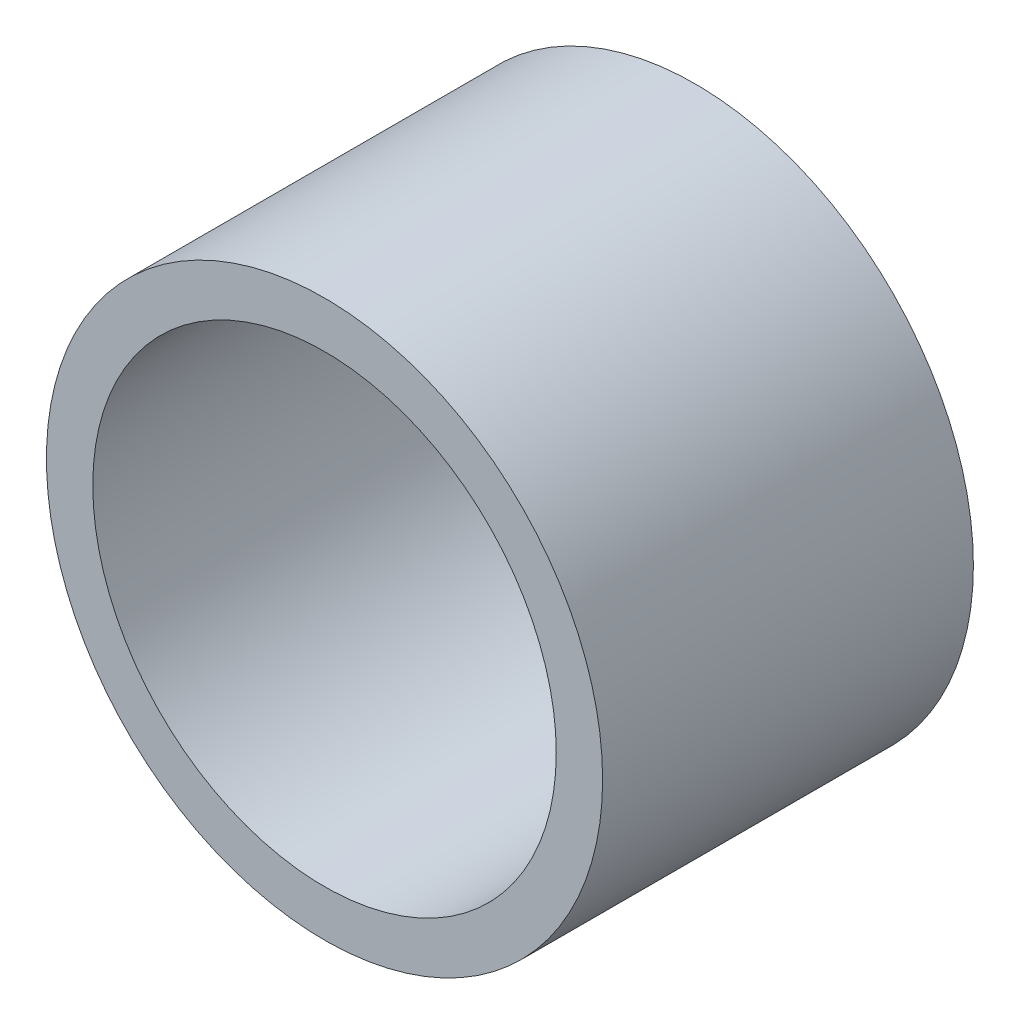
ISO-10303-21;
HEADER;
FILE_DESCRIPTION(('STEP AP214'),'2;1');
FILE_NAME('part.step','',(''),(''),'','','');
FILE_SCHEMA(('AUTOMOTIVE_DESIGN { 1 0 10303 214 1 1 1 1 }'));
ENDSEC;
DATA;
#1=APPLICATION_CONTEXT('core data for automotive mechanical design processes');
#2=APPLICATION_PROTOCOL_DEFINITION('international standard','automotive_design',2000,#1);
#3=PRODUCT_CONTEXT('',#1,'mechanical');
#4=PRODUCT('Part','Part','',(#3));
#5=PRODUCT_RELATED_PRODUCT_CATEGORY('part','',(#4));
#6=PRODUCT_DEFINITION_FORMATION('','',#4);
#7=PRODUCT_DEFINITION_CONTEXT('part definition',#1,'design');
#8=PRODUCT_DEFINITION('design','',#6,#7);
#9=PRODUCT_DEFINITION_SHAPE('','',#8);
#10=(LENGTH_UNIT() NAMED_UNIT(*) SI_UNIT(.MILLI.,.METRE.));
#11=(NAMED_UNIT(*) PLANE_ANGLE_UNIT() SI_UNIT($,.RADIAN.));
#12=(NAMED_UNIT(*) SI_UNIT($,.STERADIAN.) SOLID_ANGLE_UNIT());
#13=UNCERTAINTY_MEASURE_WITH_UNIT(LENGTH_MEASURE(1.E-05),#10,'distance_accuracy_value','');
#14=(GEOMETRIC_REPRESENTATION_CONTEXT(3) GLOBAL_UNCERTAINTY_ASSIGNED_CONTEXT((#13)) GLOBAL_UNIT_ASSIGNED_CONTEXT((#10,
#11,#12)) REPRESENTATION_CONTEXT('',''));
#15=CARTESIAN_POINT('',(0.,0.,0.));
#16=DIRECTION('',(0.,0.,1.));
#17=DIRECTION('',(1.,0.,0.));
#18=AXIS2_PLACEMENT_3D('',#15,#16,#17);
#19=CARTESIAN_POINT('',(0.,0.,-20.));
#20=DIRECTION('',(0.,0.,1.));
#21=DIRECTION('',(1.,0.,0.));
#22=AXIS2_PLACEMENT_3D('',#19,#20,#21);
#23=CYLINDRICAL_SURFACE('',#22,15.);
#24=CARTESIAN_POINT('',(0.,0.,-20.));
#25=DIRECTION('',(0.,0.,1.));
#26=DIRECTION('',(1.,0.,0.));
#27=AXIS2_PLACEMENT_3D('',#24,#25,#26);
#28=CIRCLE('',#27,15.);
#29=CARTESIAN_POINT('',(15.,0.,-20.));
#30=VERTEX_POINT('',#29);
#31=EDGE_CURVE('E10',#30,#30,#28,.T.);
#32=ORIENTED_EDGE('',*,*,#31,.T.);
#33=EDGE_LOOP('',(#32));
#34=FACE_BOUND('',#33,.T.);
#35=CARTESIAN_POINT('',(0.,0.,0.));
#36=DIRECTION('',(0.,0.,1.));
#37=DIRECTION('',(1.,0.,0.));
#38=AXIS2_PLACEMENT_3D('',#35,#36,#37);
#39=CIRCLE('',#38,15.);
#40=CARTESIAN_POINT('',(15.,0.,0.));
#41=VERTEX_POINT('',#40);
#42=EDGE_CURVE('E34',#41,#41,#39,.T.);
#43=ORIENTED_EDGE('',*,*,#42,.F.);
#44=EDGE_LOOP('',(#43));
#45=FACE_BOUND('',#44,.T.);
#46=ADVANCED_FACE('F31',(#34,#45),#23,.T.);
#47=CARTESIAN_POINT('',(0.,0.,-20.));
#48=DIRECTION('',(0.,0.,1.));
#49=DIRECTION('',(1.,0.,0.));
#50=AXIS2_PLACEMENT_3D('',#47,#48,#49);
#51=PLANE('',#50);
#52=CARTESIAN_POINT('',(0.,0.,-20.));
#53=DIRECTION('',(0.,0.,1.));
#54=DIRECTION('',(1.,0.,0.));
#55=AXIS2_PLACEMENT_3D('',#52,#53,#54);
#56=CIRCLE('',#55,12.5);
#57=CARTESIAN_POINT('',(12.5,0.,-20.));
#58=VERTEX_POINT('',#57);
#59=EDGE_CURVE('E41',#58,#58,#56,.T.);
#60=ORIENTED_EDGE('',*,*,#59,.T.);
#61=EDGE_LOOP('',(#60));
#62=FACE_BOUND('',#61,.T.);
#63=ORIENTED_EDGE('',*,*,#31,.F.);
#64=EDGE_LOOP('',(#63));
#65=FACE_BOUND('',#64,.T.);
#66=ADVANCED_FACE('F49',(#62,#65),#51,.F.);
#67=CARTESIAN_POINT('',(0.,0.,0.));
#68=DIRECTION('',(0.,0.,1.));
#69=DIRECTION('',(1.,0.,0.));
#70=AXIS2_PLACEMENT_3D('',#67,#68,#69);
#71=PLANE('',#70);
#72=CARTESIAN_POINT('',(0.,0.,0.));
#73=DIRECTION('',(0.,0.,1.));
#74=DIRECTION('',(1.,0.,0.));
#75=AXIS2_PLACEMENT_3D('',#72,#73,#74);
#76=CIRCLE('',#75,12.5);
#77=CARTESIAN_POINT('',(12.5,0.,0.));
#78=VERTEX_POINT('',#77);
#79=EDGE_CURVE('E43',#78,#78,#76,.T.);
#80=ORIENTED_EDGE('',*,*,#79,.F.);
#81=EDGE_LOOP('',(#80));
#82=FACE_BOUND('',#81,.T.);
#83=ORIENTED_EDGE('',*,*,#42,.T.);
#84=EDGE_LOOP('',(#83));
#85=FACE_BOUND('',#84,.T.);
#86=ADVANCED_FACE('F55',(#82,#85),#71,.T.);
#87=CARTESIAN_POINT('',(0.,0.,-20.));
#88=DIRECTION('',(0.,0.,1.));
#89=DIRECTION('',(1.,0.,0.));
#90=AXIS2_PLACEMENT_3D('',#87,#88,#89);
#91=CYLINDRICAL_SURFACE('',#90,12.5);
#92=ORIENTED_EDGE('',*,*,#59,.F.);
#93=EDGE_LOOP('',(#92));
#94=FACE_BOUND('',#93,.T.);
#95=ORIENTED_EDGE('',*,*,#79,.T.);
#96=EDGE_LOOP('',(#95));
#97=FACE_BOUND('',#96,.T.);
#98=ADVANCED_FACE('F52',(#94,#97),#91,.F.);
#99=CLOSED_SHELL('',(#46,#66,#86,#98));
#100=MANIFOLD_SOLID_BREP('B2',#99);
#101=ADVANCED_BREP_SHAPE_REPRESENTATION('',(#18,#100),#14);
#102=SHAPE_DEFINITION_REPRESENTATION(#9,#101);
ENDSEC;
END-ISO-10303-21;
